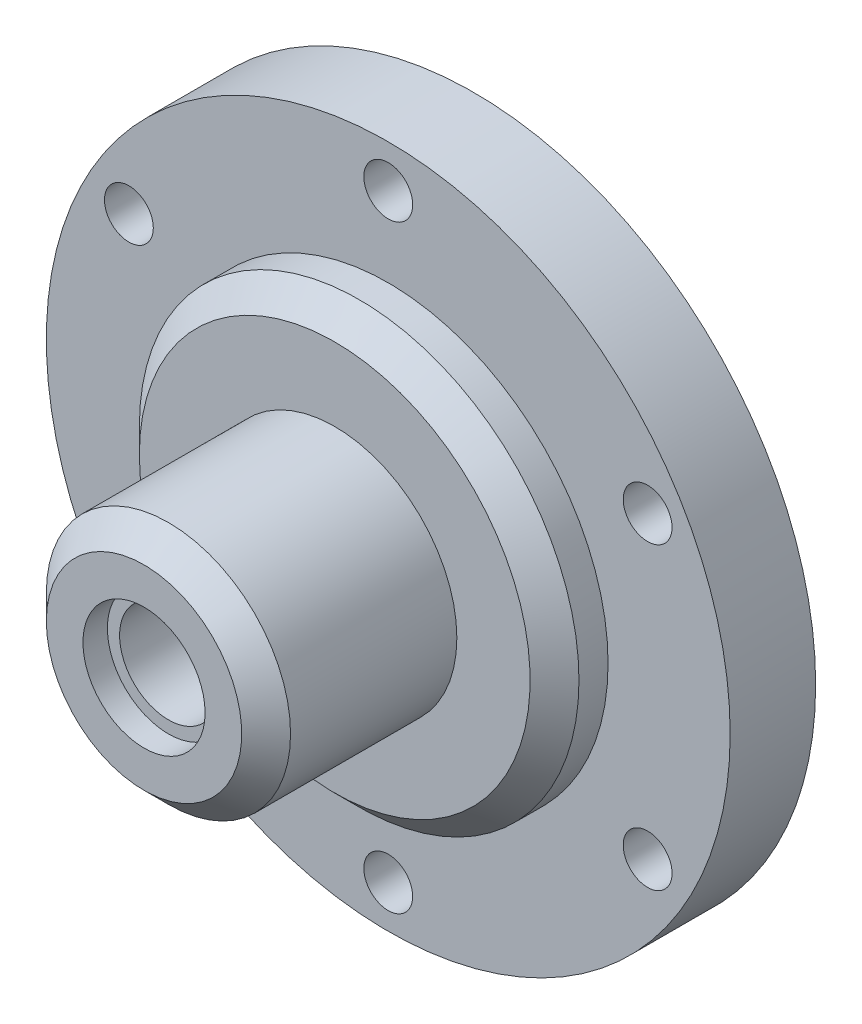
ISO-10303-21;
HEADER;
FILE_DESCRIPTION(('STEP AP214'),'2;1');
FILE_NAME('part.step','',(''),(''),'','','');
FILE_SCHEMA(('AUTOMOTIVE_DESIGN { 1 0 10303 214 1 1 1 1 }'));
ENDSEC;
DATA;
#1=APPLICATION_CONTEXT('core data for automotive mechanical design processes');
#2=APPLICATION_PROTOCOL_DEFINITION('international standard','automotive_design',2000,#1);
#3=PRODUCT_CONTEXT('',#1,'mechanical');
#4=PRODUCT('Part','Part','',(#3));
#5=PRODUCT_RELATED_PRODUCT_CATEGORY('part','',(#4));
#6=PRODUCT_DEFINITION_FORMATION('','',#4);
#7=PRODUCT_DEFINITION_CONTEXT('part definition',#1,'design');
#8=PRODUCT_DEFINITION('design','',#6,#7);
#9=PRODUCT_DEFINITION_SHAPE('','',#8);
#10=(LENGTH_UNIT() NAMED_UNIT(*) SI_UNIT(.MILLI.,.METRE.));
#11=(NAMED_UNIT(*) PLANE_ANGLE_UNIT() SI_UNIT($,.RADIAN.));
#12=(NAMED_UNIT(*) SI_UNIT($,.STERADIAN.) SOLID_ANGLE_UNIT());
#13=UNCERTAINTY_MEASURE_WITH_UNIT(LENGTH_MEASURE(1.E-05),#10,'distance_accuracy_value','');
#14=(GEOMETRIC_REPRESENTATION_CONTEXT(3) GLOBAL_UNCERTAINTY_ASSIGNED_CONTEXT((#13)) GLOBAL_UNIT_ASSIGNED_CONTEXT((#10,
#11,#12)) REPRESENTATION_CONTEXT('',''));
#15=CARTESIAN_POINT('',(0.,0.,0.));
#16=DIRECTION('',(0.,0.,1.));
#17=DIRECTION('',(1.,0.,0.));
#18=AXIS2_PLACEMENT_3D('',#15,#16,#17);
#19=CARTESIAN_POINT('',(0.,0.936746115772721,48528.1313955082));
#20=DIRECTION('',(0.,0.,1.));
#21=DIRECTION('',(1.,0.,0.));
#22=AXIS2_PLACEMENT_3D('',#19,#20,#21);
#23=CYLINDRICAL_SURFACE('',#22,200.);
#24=CARTESIAN_POINT('',(0.,0.936746115772721,-29.0164538128706));
#25=DIRECTION('',(0.,0.,1.));
#26=DIRECTION('',(1.,0.,0.));
#27=AXIS2_PLACEMENT_3D('',#24,#25,#26);
#28=CIRCLE('',#27,200.);
#29=CARTESIAN_POINT('',(200.,0.936746115772721,-29.0164538128706));
#30=VERTEX_POINT('',#29);
#31=EDGE_CURVE('E168',#30,#30,#28,.T.);
#32=ORIENTED_EDGE('',*,*,#31,.F.);
#33=EDGE_LOOP('',(#32));
#34=FACE_BOUND('',#33,.T.);
#35=CARTESIAN_POINT('',(0.,0.936746115772721,870.983546187129));
#36=DIRECTION('',(0.,0.,1.));
#37=DIRECTION('',(1.,0.,0.));
#38=AXIS2_PLACEMENT_3D('',#35,#36,#37);
#39=CIRCLE('',#38,199.999999999617);
#40=CARTESIAN_POINT('',(199.999999999617,0.936746115772721,870.983546187129));
#41=VERTEX_POINT('',#40);
#42=EDGE_CURVE('E374',#41,#41,#39,.T.);
#43=ORIENTED_EDGE('',*,*,#42,.T.);
#44=EDGE_LOOP('',(#43));
#45=FACE_BOUND('',#44,.T.);
#46=ADVANCED_FACE('F46',(#34,#45),#23,.F.);
#47=CARTESIAN_POINT('',(0.,0.936746115772721,-29.0164538128706));
#48=DIRECTION('',(0.,0.,1.));
#49=DIRECTION('',(1.,0.,0.));
#50=AXIS2_PLACEMENT_3D('',#47,#48,#49);
#51=PLANE('',#50);
#52=DIRECTION('',(0.,-1.,0.));
#53=VECTOR('',#52,1.);
#54=CARTESIAN_POINT('',(100.,750.936746115774,-29.0164538128706));
#55=LINE('',#54,#53);
#56=CARTESIAN_POINT('',(100.,750.936746115774,-29.0164538128706));
#57=VERTEX_POINT('',#56);
#58=CARTESIAN_POINT('',(100.,693.757069143324,-29.0164538128706));
#59=VERTEX_POINT('',#58);
#60=EDGE_CURVE('E92',#57,#59,#55,.T.);
#61=ORIENTED_EDGE('',*,*,#60,.T.);
#62=CARTESIAN_POINT('',(0.,0.936746115772721,-29.0164538128706));
#63=DIRECTION('',(0.,0.,1.));
#64=DIRECTION('',(1.,0.,0.));
#65=AXIS2_PLACEMENT_3D('',#62,#63,#64);
#66=CIRCLE('',#65,700.);
#67=CARTESIAN_POINT('',(-100.,693.757069143324,-29.0164538128706));
#68=VERTEX_POINT('',#67);
#69=EDGE_CURVE('E183',#68,#59,#66,.T.);
#70=ORIENTED_EDGE('',*,*,#69,.F.);
#71=DIRECTION('',(0.,1.,0.));
#72=VECTOR('',#71,1.);
#73=CARTESIAN_POINT('',(-99.9999999999999,750.936746115774,-29.0164538128706));
#74=LINE('',#73,#72);
#75=CARTESIAN_POINT('',(-99.9999999999999,750.936746115774,-29.0164538128706));
#76=VERTEX_POINT('',#75);
#77=EDGE_CURVE('E61',#68,#76,#74,.T.);
#78=ORIENTED_EDGE('',*,*,#77,.T.);
#79=DIRECTION('',(1.,0.,0.));
#80=VECTOR('',#79,1.);
#81=CARTESIAN_POINT('',(100.,750.936746115774,-29.0164538128706));
#82=LINE('',#81,#80);
#83=EDGE_CURVE('E101',#76,#57,#82,.T.);
#84=ORIENTED_EDGE('',*,*,#83,.T.);
#85=EDGE_LOOP('',(#61,#70,#78,#84));
#86=FACE_BOUND('',#85,.T.);
#87=ORIENTED_EDGE('',*,*,#31,.T.);
#88=EDGE_LOOP('',(#87));
#89=FACE_BOUND('',#88,.T.);
#90=ADVANCED_FACE('F189',(#86,#89),#51,.F.);
#91=CARTESIAN_POINT('',(0.,200.936746115773,970.983546187129));
#92=DIRECTION('',(0.,0.,-1.));
#93=DIRECTION('',(-1.,0.,0.));
#94=AXIS2_PLACEMENT_3D('',#91,#92,#93);
#95=PLANE('',#94);
#96=CARTESIAN_POINT('',(0.,0.936746115772721,970.983546187129));
#97=DIRECTION('',(0.,0.,1.));
#98=DIRECTION('',(1.,0.,0.));
#99=AXIS2_PLACEMENT_3D('',#96,#97,#98);
#100=CIRCLE('',#99,249.999999999617);
#101=CARTESIAN_POINT('',(249.999999999617,0.936746115772721,970.983546187129));
#102=VERTEX_POINT('',#101);
#103=EDGE_CURVE('E109',#102,#102,#100,.T.);
#104=ORIENTED_EDGE('',*,*,#103,.F.);
#105=EDGE_LOOP('',(#104));
#106=FACE_BOUND('',#105,.T.);
#107=CARTESIAN_POINT('',(0.,0.936746115772721,970.983546187129));
#108=DIRECTION('',(0.,0.,-1.));
#109=DIRECTION('',(-1.,0.,0.));
#110=AXIS2_PLACEMENT_3D('',#107,#108,#109);
#111=CIRCLE('',#110,399.999999999993);
#112=CARTESIAN_POINT('',(-399.999999999993,0.936746115772721,970.983546187129));
#113=VERTEX_POINT('',#112);
#114=EDGE_CURVE('E177',#113,#113,#111,.F.);
#115=ORIENTED_EDGE('',*,*,#114,.T.);
#116=EDGE_LOOP('',(#115));
#117=FACE_BOUND('',#116,.T.);
#118=ADVANCED_FACE('F211',(#106,#117),#95,.F.);
#119=CARTESIAN_POINT('',(0.,0.936746115772721,48528.1313955082));
#120=DIRECTION('',(0.,0.,1.));
#121=DIRECTION('',(1.,0.,0.));
#122=AXIS2_PLACEMENT_3D('',#119,#120,#121);
#123=CYLINDRICAL_SURFACE('',#122,500.);
#124=CARTESIAN_POINT('',(0.,0.936746115772721,870.983546187128));
#125=DIRECTION('',(0.,0.,-1.));
#126=DIRECTION('',(-1.,0.,0.));
#127=AXIS2_PLACEMENT_3D('',#124,#125,#126);
#128=CIRCLE('',#127,500.);
#129=CARTESIAN_POINT('',(-500.,0.936746115772721,870.983546187128));
#130=VERTEX_POINT('',#129);
#131=EDGE_CURVE('E180',#130,#130,#128,.T.);
#132=ORIENTED_EDGE('',*,*,#131,.T.);
#133=EDGE_LOOP('',(#132));
#134=FACE_BOUND('',#133,.T.);
#135=CARTESIAN_POINT('',(0.,0.936746115772721,190.103102033601));
#136=DIRECTION('',(0.,0.,1.));
#137=DIRECTION('',(1.,0.,0.));
#138=AXIS2_PLACEMENT_3D('',#135,#136,#137);
#139=CIRCLE('',#138,500.);
#140=CARTESIAN_POINT('',(500.,0.936746115772721,190.103102033601));
#141=VERTEX_POINT('',#140);
#142=EDGE_CURVE('E165',#141,#141,#139,.T.);
#143=ORIENTED_EDGE('',*,*,#142,.T.);
#144=EDGE_LOOP('',(#143));
#145=FACE_BOUND('',#144,.T.);
#146=ADVANCED_FACE('F236',(#134,#145),#123,.T.);
#147=CARTESIAN_POINT('',(0.,500.936746115772,190.1031020336));
#148=DIRECTION('',(0.,0.,-1.));
#149=DIRECTION('',(-1.,0.,0.));
#150=AXIS2_PLACEMENT_3D('',#147,#148,#149);
#151=PLANE('',#150);
#152=CARTESIAN_POINT('',(0.,0.936746115772721,190.1031020336));
#153=DIRECTION('',(0.,0.,-1.));
#154=DIRECTION('',(-1.,0.,0.));
#155=AXIS2_PLACEMENT_3D('',#152,#153,#154);
#156=CIRCLE('',#155,800.000000000005);
#157=CARTESIAN_POINT('',(-800.000000000005,0.936746115772721,190.1031020336));
#158=VERTEX_POINT('',#157);
#159=EDGE_CURVE('E171',#158,#158,#156,.F.);
#160=ORIENTED_EDGE('',*,*,#159,.T.);
#161=EDGE_LOOP('',(#160));
#162=FACE_BOUND('',#161,.T.);
#163=ORIENTED_EDGE('',*,*,#142,.F.);
#164=EDGE_LOOP('',(#163));
#165=FACE_BOUND('',#164,.T.);
#166=ADVANCED_FACE('F227',(#162,#165),#151,.F.);
#167=CARTESIAN_POINT('',(0.,0.936746115772721,48528.1313955082));
#168=DIRECTION('',(0.,0.,1.));
#169=DIRECTION('',(1.,0.,0.));
#170=AXIS2_PLACEMENT_3D('',#167,#168,#169);
#171=CYLINDRICAL_SURFACE('',#170,900.);
#172=CARTESIAN_POINT('',(0.,0.936746115772721,90.1031020336035));
#173=DIRECTION('',(0.,0.,-1.));
#174=DIRECTION('',(-1.,0.,0.));
#175=AXIS2_PLACEMENT_3D('',#172,#173,#174);
#176=CIRCLE('',#175,900.);
#177=CARTESIAN_POINT('',(-900.,0.936746115772721,90.1031020336035));
#178=VERTEX_POINT('',#177);
#179=EDGE_CURVE('E174',#178,#178,#176,.T.);
#180=ORIENTED_EDGE('',*,*,#179,.T.);
#181=EDGE_LOOP('',(#180));
#182=FACE_BOUND('',#181,.T.);
#183=CARTESIAN_POINT('',(0.,0.936746115772721,-29.0164538128706));
#184=DIRECTION('',(0.,0.,1.));
#185=DIRECTION('',(1.,0.,0.));
#186=AXIS2_PLACEMENT_3D('',#183,#184,#185);
#187=CIRCLE('',#186,900.);
#188=CARTESIAN_POINT('',(900.,0.936746115772721,-29.0164538128706));
#189=VERTEX_POINT('',#188);
#190=EDGE_CURVE('E160',#189,#189,#187,.T.);
#191=ORIENTED_EDGE('',*,*,#190,.T.);
#192=EDGE_LOOP('',(#191));
#193=FACE_BOUND('',#192,.T.);
#194=ADVANCED_FACE('F219',(#182,#193),#171,.T.);
#195=CARTESIAN_POINT('',(0.,0.936746115772721,190.103102033601));
#196=DIRECTION('',(0.,0.,-1.));
#197=DIRECTION('',(-1.,0.,0.));
#198=AXIS2_PLACEMENT_3D('',#195,#196,#197);
#199=CONICAL_SURFACE('',#198,800.000000000004,0.785398163397439);
#200=ORIENTED_EDGE('',*,*,#179,.F.);
#201=EDGE_LOOP('',(#200));
#202=FACE_BOUND('',#201,.T.);
#203=ORIENTED_EDGE('',*,*,#159,.F.);
#204=EDGE_LOOP('',(#203));
#205=FACE_BOUND('',#204,.T.);
#206=ADVANCED_FACE('F217',(#202,#205),#199,.T.);
#207=CARTESIAN_POINT('',(0.,0.936746115772721,970.983546187126));
#208=DIRECTION('',(0.,0.,-1.));
#209=DIRECTION('',(-1.,0.,0.));
#210=AXIS2_PLACEMENT_3D('',#207,#208,#209);
#211=CONICAL_SURFACE('',#210,399.999999999997,0.785398163397473);
#212=ORIENTED_EDGE('',*,*,#131,.F.);
#213=EDGE_LOOP('',(#212));
#214=FACE_BOUND('',#213,.T.);
#215=ORIENTED_EDGE('',*,*,#114,.F.);
#216=EDGE_LOOP('',(#215));
#217=FACE_BOUND('',#216,.T.);
#218=ADVANCED_FACE('F48',(#214,#217),#211,.T.);
#219=CARTESIAN_POINT('',(0.,0.936746115772721,-379.016453812871));
#220=DIRECTION('',(0.,0.,1.));
#221=DIRECTION('',(1.,0.,0.));
#222=AXIS2_PLACEMENT_3D('',#219,#220,#221);
#223=CYLINDRICAL_SURFACE('',#222,1400.);
#224=CARTESIAN_POINT('',(0.,0.936746115772721,-379.016453812871));
#225=DIRECTION('',(0.,0.,1.));
#226=DIRECTION('',(1.,0.,0.));
#227=AXIS2_PLACEMENT_3D('',#224,#225,#226);
#228=CIRCLE('',#227,1400.);
#229=CARTESIAN_POINT('',(1400.,0.936746115772721,-379.016453812871));
#230=VERTEX_POINT('',#229);
#231=EDGE_CURVE('E157',#230,#230,#228,.T.);
#232=ORIENTED_EDGE('',*,*,#231,.T.);
#233=EDGE_LOOP('',(#232));
#234=FACE_BOUND('',#233,.T.);
#235=CARTESIAN_POINT('',(0.,0.936746115772721,-29.0164538128706));
#236=DIRECTION('',(0.,0.,1.));
#237=DIRECTION('',(1.,0.,0.));
#238=AXIS2_PLACEMENT_3D('',#235,#236,#237);
#239=CIRCLE('',#238,1400.);
#240=CARTESIAN_POINT('',(1400.,0.936746115772721,-29.0164538128706));
#241=VERTEX_POINT('',#240);
#242=EDGE_CURVE('E156',#241,#241,#239,.T.);
#243=ORIENTED_EDGE('',*,*,#242,.F.);
#244=EDGE_LOOP('',(#243));
#245=FACE_BOUND('',#244,.T.);
#246=ADVANCED_FACE('F225',(#234,#245),#223,.T.);
#247=CARTESIAN_POINT('',(0.,0.936746115772721,-379.016453812871));
#248=DIRECTION('',(0.,0.,1.));
#249=DIRECTION('',(1.,0.,0.));
#250=AXIS2_PLACEMENT_3D('',#247,#248,#249);
#251=PLANE('',#250);
#252=CARTESIAN_POINT('',(0.,0.936746115772721,-379.016453812871));
#253=DIRECTION('',(0.,0.,1.));
#254=DIRECTION('',(1.,0.,0.));
#255=AXIS2_PLACEMENT_3D('',#252,#253,#254);
#256=CIRCLE('',#255,700.);
#257=CARTESIAN_POINT('',(-100.,693.757069143324,-379.016453812871));
#258=VERTEX_POINT('',#257);
#259=CARTESIAN_POINT('',(100.,693.757069143324,-379.016453812871));
#260=VERTEX_POINT('',#259);
#261=EDGE_CURVE('E122',#258,#260,#256,.T.);
#262=ORIENTED_EDGE('',*,*,#261,.T.);
#263=DIRECTION('',(0.,-1.,0.));
#264=VECTOR('',#263,1.);
#265=CARTESIAN_POINT('',(100.,750.936746115774,-379.016453812871));
#266=LINE('',#265,#264);
#267=CARTESIAN_POINT('',(100.,750.936746115774,-379.016453812871));
#268=VERTEX_POINT('',#267);
#269=EDGE_CURVE('E69',#268,#260,#266,.T.);
#270=ORIENTED_EDGE('',*,*,#269,.F.);
#271=DIRECTION('',(1.,0.,0.));
#272=VECTOR('',#271,1.);
#273=CARTESIAN_POINT('',(100.,750.936746115774,-379.016453812871));
#274=LINE('',#273,#272);
#275=CARTESIAN_POINT('',(-99.9999999999999,750.936746115774,-379.016453812871));
#276=VERTEX_POINT('',#275);
#277=EDGE_CURVE('E99',#276,#268,#274,.T.);
#278=ORIENTED_EDGE('',*,*,#277,.F.);
#279=DIRECTION('',(0.,1.,0.));
#280=VECTOR('',#279,1.);
#281=CARTESIAN_POINT('',(-99.9999999999999,750.936746115774,-379.016453812871));
#282=LINE('',#281,#280);
#283=EDGE_CURVE('E84',#258,#276,#282,.T.);
#284=ORIENTED_EDGE('',*,*,#283,.F.);
#285=EDGE_LOOP('',(#262,#270,#278,#284));
#286=FACE_BOUND('',#285,.T.);
#287=CARTESIAN_POINT('',(0.,1227.18674611577,-379.016453812871));
#288=DIRECTION('',(0.,0.,1.));
#289=DIRECTION('',(1.,0.,0.));
#290=AXIS2_PLACEMENT_3D('',#287,#288,#289);
#291=CIRCLE('',#290,100.);
#292=CARTESIAN_POINT('',(99.9999999999999,1227.18674611577,-379.016453812871));
#293=VERTEX_POINT('',#292);
#294=EDGE_CURVE('E119',#293,#293,#291,.T.);
#295=ORIENTED_EDGE('',*,*,#294,.T.);
#296=EDGE_LOOP('',(#295));
#297=FACE_BOUND('',#296,.T.);
#298=CARTESIAN_POINT('',(-1061.96365139066,614.061746115785,-379.016453812871));
#299=DIRECTION('',(0.,0.,1.));
#300=DIRECTION('',(1.,0.,0.));
#301=AXIS2_PLACEMENT_3D('',#298,#299,#300);
#302=CIRCLE('',#301,100.);
#303=CARTESIAN_POINT('',(-961.963651390661,614.061746115785,-379.016453812871));
#304=VERTEX_POINT('',#303);
#305=EDGE_CURVE('E118',#304,#304,#302,.T.);
#306=ORIENTED_EDGE('',*,*,#305,.T.);
#307=EDGE_LOOP('',(#306));
#308=FACE_BOUND('',#307,.T.);
#309=CARTESIAN_POINT('',(-1061.96365139067,-612.188253884217,-379.016453812871));
#310=DIRECTION('',(0.,0.,1.));
#311=DIRECTION('',(1.,0.,0.));
#312=AXIS2_PLACEMENT_3D('',#309,#310,#311);
#313=CIRCLE('',#312,100.);
#314=CARTESIAN_POINT('',(-961.963651390674,-612.188253884217,-379.016453812871));
#315=VERTEX_POINT('',#314);
#316=EDGE_CURVE('E130',#315,#315,#313,.T.);
#317=ORIENTED_EDGE('',*,*,#316,.T.);
#318=EDGE_LOOP('',(#317));
#319=FACE_BOUND('',#318,.T.);
#320=CARTESIAN_POINT('',(-8.63872100725658E-12,-1225.31325388423,-379.016453812871));
#321=DIRECTION('',(0.,0.,1.));
#322=DIRECTION('',(1.,0.,0.));
#323=AXIS2_PLACEMENT_3D('',#320,#321,#322);
#324=CIRCLE('',#323,100.);
#325=CARTESIAN_POINT('',(99.9999999999914,-1225.31325388423,-379.016453812871));
#326=VERTEX_POINT('',#325);
#327=EDGE_CURVE('E147',#326,#326,#324,.T.);
#328=ORIENTED_EDGE('',*,*,#327,.T.);
#329=EDGE_LOOP('',(#328));
#330=FACE_BOUND('',#329,.T.);
#331=CARTESIAN_POINT('',(1061.96365139067,-612.188253884232,-379.016453812871));
#332=DIRECTION('',(0.,0.,1.));
#333=DIRECTION('',(1.,0.,0.));
#334=AXIS2_PLACEMENT_3D('',#331,#332,#333);
#335=CIRCLE('',#334,100.);
#336=CARTESIAN_POINT('',(1161.96365139067,-612.188253884232,-379.016453812871));
#337=VERTEX_POINT('',#336);
#338=EDGE_CURVE('E141',#337,#337,#335,.T.);
#339=ORIENTED_EDGE('',*,*,#338,.T.);
#340=EDGE_LOOP('',(#339));
#341=FACE_BOUND('',#340,.T.);
#342=CARTESIAN_POINT('',(1061.96365139067,614.06174611577,-379.016453812871));
#343=DIRECTION('',(0.,0.,1.));
#344=DIRECTION('',(1.,0.,0.));
#345=AXIS2_PLACEMENT_3D('',#342,#343,#344);
#346=CIRCLE('',#345,99.9999999999999);
#347=CARTESIAN_POINT('',(1161.96365139067,614.06174611577,-379.016453812871));
#348=VERTEX_POINT('',#347);
#349=EDGE_CURVE('E135',#348,#348,#346,.T.);
#350=ORIENTED_EDGE('',*,*,#349,.T.);
#351=EDGE_LOOP('',(#350));
#352=FACE_BOUND('',#351,.T.);
#353=ORIENTED_EDGE('',*,*,#231,.F.);
#354=EDGE_LOOP('',(#353));
#355=FACE_BOUND('',#354,.T.);
#356=ADVANCED_FACE('F103',(#286,#297,#308,#319,#330,#341,#352,#355),#251,.F.);
#357=CARTESIAN_POINT('',(0.,0.936746115772721,-29.0164538128706));
#358=DIRECTION('',(0.,0.,1.));
#359=DIRECTION('',(1.,0.,0.));
#360=AXIS2_PLACEMENT_3D('',#357,#358,#359);
#361=PLANE('',#360);
#362=CARTESIAN_POINT('',(0.,1227.18674611577,-29.0164538128706));
#363=DIRECTION('',(0.,0.,1.));
#364=DIRECTION('',(1.,0.,0.));
#365=AXIS2_PLACEMENT_3D('',#362,#363,#364);
#366=CIRCLE('',#365,100.);
#367=CARTESIAN_POINT('',(99.9999999999999,1227.18674611577,-29.0164538128706));
#368=VERTEX_POINT('',#367);
#369=EDGE_CURVE('E123',#368,#368,#366,.T.);
#370=ORIENTED_EDGE('',*,*,#369,.F.);
#371=EDGE_LOOP('',(#370));
#372=FACE_BOUND('',#371,.T.);
#373=CARTESIAN_POINT('',(-1061.96365139066,614.061746115785,-29.0164538128706));
#374=DIRECTION('',(0.,0.,1.));
#375=DIRECTION('',(1.,0.,0.));
#376=AXIS2_PLACEMENT_3D('',#373,#374,#375);
#377=CIRCLE('',#376,100.);
#378=CARTESIAN_POINT('',(-961.963651390661,614.061746115785,-29.0164538128706));
#379=VERTEX_POINT('',#378);
#380=EDGE_CURVE('E127',#379,#379,#377,.T.);
#381=ORIENTED_EDGE('',*,*,#380,.F.);
#382=EDGE_LOOP('',(#381));
#383=FACE_BOUND('',#382,.T.);
#384=CARTESIAN_POINT('',(-1061.96365139067,-612.188253884217,-29.0164538128706));
#385=DIRECTION('',(0.,0.,1.));
#386=DIRECTION('',(1.,0.,0.));
#387=AXIS2_PLACEMENT_3D('',#384,#385,#386);
#388=CIRCLE('',#387,100.);
#389=CARTESIAN_POINT('',(-961.963651390674,-612.188253884217,-29.0164538128706));
#390=VERTEX_POINT('',#389);
#391=EDGE_CURVE('E150',#390,#390,#388,.T.);
#392=ORIENTED_EDGE('',*,*,#391,.F.);
#393=EDGE_LOOP('',(#392));
#394=FACE_BOUND('',#393,.T.);
#395=CARTESIAN_POINT('',(-8.63872100725658E-12,-1225.31325388423,-29.0164538128706));
#396=DIRECTION('',(0.,0.,1.));
#397=DIRECTION('',(1.,0.,0.));
#398=AXIS2_PLACEMENT_3D('',#395,#396,#397);
#399=CIRCLE('',#398,100.);
#400=CARTESIAN_POINT('',(99.9999999999914,-1225.31325388423,-29.0164538128706));
#401=VERTEX_POINT('',#400);
#402=EDGE_CURVE('E144',#401,#401,#399,.T.);
#403=ORIENTED_EDGE('',*,*,#402,.F.);
#404=EDGE_LOOP('',(#403));
#405=FACE_BOUND('',#404,.T.);
#406=CARTESIAN_POINT('',(1061.96365139067,-612.188253884232,-29.0164538128706));
#407=DIRECTION('',(0.,0.,1.));
#408=DIRECTION('',(1.,0.,0.));
#409=AXIS2_PLACEMENT_3D('',#406,#407,#408);
#410=CIRCLE('',#409,100.);
#411=CARTESIAN_POINT('',(1161.96365139067,-612.188253884232,-29.0164538128706));
#412=VERTEX_POINT('',#411);
#413=EDGE_CURVE('E138',#412,#412,#410,.T.);
#414=ORIENTED_EDGE('',*,*,#413,.F.);
#415=EDGE_LOOP('',(#414));
#416=FACE_BOUND('',#415,.T.);
#417=CARTESIAN_POINT('',(1061.96365139067,614.06174611577,-29.0164538128706));
#418=DIRECTION('',(0.,0.,1.));
#419=DIRECTION('',(1.,0.,0.));
#420=AXIS2_PLACEMENT_3D('',#417,#418,#419);
#421=CIRCLE('',#420,99.9999999999999);
#422=CARTESIAN_POINT('',(1161.96365139067,614.06174611577,-29.0164538128706));
#423=VERTEX_POINT('',#422);
#424=EDGE_CURVE('E126',#423,#423,#421,.T.);
#425=ORIENTED_EDGE('',*,*,#424,.F.);
#426=EDGE_LOOP('',(#425));
#427=FACE_BOUND('',#426,.T.);
#428=ORIENTED_EDGE('',*,*,#190,.F.);
#429=EDGE_LOOP('',(#428));
#430=FACE_BOUND('',#429,.T.);
#431=ORIENTED_EDGE('',*,*,#242,.T.);
#432=EDGE_LOOP('',(#431));
#433=FACE_BOUND('',#432,.T.);
#434=ADVANCED_FACE('F249',(#372,#383,#394,#405,#416,#427,#430,#433),#361,.T.);
#435=CARTESIAN_POINT('',(0.,0.936746115772721,-379.016453812871));
#436=DIRECTION('',(0.,0.,1.));
#437=DIRECTION('',(1.,0.,0.));
#438=AXIS2_PLACEMENT_3D('',#435,#436,#437);
#439=CYLINDRICAL_SURFACE('',#438,700.);
#440=ORIENTED_EDGE('',*,*,#69,.T.);
#441=DIRECTION('',(0.,0.,1.));
#442=VECTOR('',#441,1.);
#443=CARTESIAN_POINT('',(100.,693.757069143324,-379.016453812871));
#444=LINE('',#443,#442);
#445=EDGE_CURVE('E12',#59,#260,#444,.F.);
#446=ORIENTED_EDGE('',*,*,#445,.T.);
#447=ORIENTED_EDGE('',*,*,#261,.F.);
#448=DIRECTION('',(0.,0.,1.));
#449=VECTOR('',#448,1.);
#450=CARTESIAN_POINT('',(-100.,693.757069143324,-379.016453812871));
#451=LINE('',#450,#449);
#452=EDGE_CURVE('E54',#258,#68,#451,.T.);
#453=ORIENTED_EDGE('',*,*,#452,.T.);
#454=EDGE_LOOP('',(#440,#446,#447,#453));
#455=FACE_BOUND('',#454,.T.);
#456=ADVANCED_FACE('F187',(#455),#439,.F.);
#457=CARTESIAN_POINT('',(1061.96365139067,614.06174611577,-379.016453812871));
#458=DIRECTION('',(0.,0.,1.));
#459=DIRECTION('',(1.,0.,0.));
#460=AXIS2_PLACEMENT_3D('',#457,#458,#459);
#461=CYLINDRICAL_SURFACE('',#460,99.9999999999999);
#462=ORIENTED_EDGE('',*,*,#349,.F.);
#463=EDGE_LOOP('',(#462));
#464=FACE_BOUND('',#463,.T.);
#465=ORIENTED_EDGE('',*,*,#424,.T.);
#466=EDGE_LOOP('',(#465));
#467=FACE_BOUND('',#466,.T.);
#468=ADVANCED_FACE('F257',(#464,#467),#461,.F.);
#469=CARTESIAN_POINT('',(1061.96365139067,-612.188253884232,-379.016453812871));
#470=DIRECTION('',(0.,0.,1.));
#471=DIRECTION('',(1.,0.,0.));
#472=AXIS2_PLACEMENT_3D('',#469,#470,#471);
#473=CYLINDRICAL_SURFACE('',#472,100.);
#474=ORIENTED_EDGE('',*,*,#338,.F.);
#475=EDGE_LOOP('',(#474));
#476=FACE_BOUND('',#475,.T.);
#477=ORIENTED_EDGE('',*,*,#413,.T.);
#478=EDGE_LOOP('',(#477));
#479=FACE_BOUND('',#478,.T.);
#480=ADVANCED_FACE('F265',(#476,#479),#473,.F.);
#481=CARTESIAN_POINT('',(-8.63872100725658E-12,-1225.31325388423,-379.016453812871));
#482=DIRECTION('',(0.,0.,1.));
#483=DIRECTION('',(1.,0.,0.));
#484=AXIS2_PLACEMENT_3D('',#481,#482,#483);
#485=CYLINDRICAL_SURFACE('',#484,100.);
#486=ORIENTED_EDGE('',*,*,#327,.F.);
#487=EDGE_LOOP('',(#486));
#488=FACE_BOUND('',#487,.T.);
#489=ORIENTED_EDGE('',*,*,#402,.T.);
#490=EDGE_LOOP('',(#489));
#491=FACE_BOUND('',#490,.T.);
#492=ADVANCED_FACE('F261',(#488,#491),#485,.F.);
#493=CARTESIAN_POINT('',(-1061.96365139067,-612.188253884217,-379.016453812871));
#494=DIRECTION('',(0.,0.,1.));
#495=DIRECTION('',(1.,0.,0.));
#496=AXIS2_PLACEMENT_3D('',#493,#494,#495);
#497=CYLINDRICAL_SURFACE('',#496,100.);
#498=ORIENTED_EDGE('',*,*,#316,.F.);
#499=EDGE_LOOP('',(#498));
#500=FACE_BOUND('',#499,.T.);
#501=ORIENTED_EDGE('',*,*,#391,.T.);
#502=EDGE_LOOP('',(#501));
#503=FACE_BOUND('',#502,.T.);
#504=ADVANCED_FACE('F258',(#500,#503),#497,.F.);
#505=CARTESIAN_POINT('',(-1061.96365139066,614.061746115785,-379.016453812871));
#506=DIRECTION('',(0.,0.,1.));
#507=DIRECTION('',(1.,0.,0.));
#508=AXIS2_PLACEMENT_3D('',#505,#506,#507);
#509=CYLINDRICAL_SURFACE('',#508,100.);
#510=ORIENTED_EDGE('',*,*,#305,.F.);
#511=EDGE_LOOP('',(#510));
#512=FACE_BOUND('',#511,.T.);
#513=ORIENTED_EDGE('',*,*,#380,.T.);
#514=EDGE_LOOP('',(#513));
#515=FACE_BOUND('',#514,.T.);
#516=ADVANCED_FACE('F200',(#512,#515),#509,.F.);
#517=CARTESIAN_POINT('',(0.,1227.18674611577,-379.016453812871));
#518=DIRECTION('',(0.,0.,1.));
#519=DIRECTION('',(1.,0.,0.));
#520=AXIS2_PLACEMENT_3D('',#517,#518,#519);
#521=CYLINDRICAL_SURFACE('',#520,100.);
#522=ORIENTED_EDGE('',*,*,#294,.F.);
#523=EDGE_LOOP('',(#522));
#524=FACE_BOUND('',#523,.T.);
#525=ORIENTED_EDGE('',*,*,#369,.T.);
#526=EDGE_LOOP('',(#525));
#527=FACE_BOUND('',#526,.T.);
#528=ADVANCED_FACE('F193',(#524,#527),#521,.F.);
#529=CARTESIAN_POINT('',(100.,750.936746115774,182.998237369024));
#530=DIRECTION('',(1.,0.,0.));
#531=DIRECTION('',(0.,1.,0.));
#532=AXIS2_PLACEMENT_3D('',#529,#530,#531);
#533=PLANE('',#532);
#534=ORIENTED_EDGE('',*,*,#60,.F.);
#535=DIRECTION('',(0.,0.,-1.));
#536=VECTOR('',#535,1.);
#537=CARTESIAN_POINT('',(100.,750.936746115774,182.998237369024));
#538=LINE('',#537,#536);
#539=EDGE_CURVE('E115',#57,#268,#538,.T.);
#540=ORIENTED_EDGE('',*,*,#539,.T.);
#541=ORIENTED_EDGE('',*,*,#269,.T.);
#542=ORIENTED_EDGE('',*,*,#445,.F.);
#543=EDGE_LOOP('',(#534,#540,#541,#542));
#544=FACE_BOUND('',#543,.T.);
#545=ADVANCED_FACE('F191',(#544),#533,.F.);
#546=CARTESIAN_POINT('',(-99.9999999999999,750.936746115774,182.998237369024));
#547=DIRECTION('',(-1.,0.,0.));
#548=DIRECTION('',(0.,-1.,0.));
#549=AXIS2_PLACEMENT_3D('',#546,#547,#548);
#550=PLANE('',#549);
#551=ORIENTED_EDGE('',*,*,#283,.T.);
#552=DIRECTION('',(0.,0.,-1.));
#553=VECTOR('',#552,1.);
#554=CARTESIAN_POINT('',(-99.9999999999999,750.936746115774,182.998237369024));
#555=LINE('',#554,#553);
#556=EDGE_CURVE('E87',#76,#276,#555,.T.);
#557=ORIENTED_EDGE('',*,*,#556,.F.);
#558=ORIENTED_EDGE('',*,*,#77,.F.);
#559=ORIENTED_EDGE('',*,*,#452,.F.);
#560=EDGE_LOOP('',(#551,#557,#558,#559));
#561=FACE_BOUND('',#560,.T.);
#562=ADVANCED_FACE('F86',(#561),#550,.F.);
#563=CARTESIAN_POINT('',(100.,750.936746115774,182.998237369024));
#564=DIRECTION('',(0.,1.,0.));
#565=DIRECTION('',(0.,0.,1.));
#566=AXIS2_PLACEMENT_3D('',#563,#564,#565);
#567=PLANE('',#566);
#568=ORIENTED_EDGE('',*,*,#556,.T.);
#569=ORIENTED_EDGE('',*,*,#277,.T.);
#570=ORIENTED_EDGE('',*,*,#539,.F.);
#571=ORIENTED_EDGE('',*,*,#83,.F.);
#572=EDGE_LOOP('',(#568,#569,#570,#571));
#573=FACE_BOUND('',#572,.T.);
#574=ADVANCED_FACE('F97',(#573),#567,.F.);
#575=CARTESIAN_POINT('',(0.,0.936746115772721,870.983546187129));
#576=DIRECTION('',(0.,0.,1.));
#577=DIRECTION('',(1.,0.,0.));
#578=AXIS2_PLACEMENT_3D('',#575,#576,#577);
#579=CYLINDRICAL_SURFACE('',#578,249.999999999617);
#580=CARTESIAN_POINT('',(0.,0.936746115772721,870.983546187129));
#581=DIRECTION('',(0.,0.,1.));
#582=DIRECTION('',(1.,0.,0.));
#583=AXIS2_PLACEMENT_3D('',#580,#581,#582);
#584=CIRCLE('',#583,249.999999999617);
#585=CARTESIAN_POINT('',(249.999999999617,0.936746115772721,870.983546187129));
#586=VERTEX_POINT('',#585);
#587=EDGE_CURVE('E105',#586,#586,#584,.T.);
#588=ORIENTED_EDGE('',*,*,#587,.F.);
#589=EDGE_LOOP('',(#588));
#590=FACE_BOUND('',#589,.T.);
#591=ORIENTED_EDGE('',*,*,#103,.T.);
#592=EDGE_LOOP('',(#591));
#593=FACE_BOUND('',#592,.T.);
#594=ADVANCED_FACE('F345',(#590,#593),#579,.F.);
#595=CARTESIAN_POINT('',(0.,0.936746115772721,870.983546187129));
#596=DIRECTION('',(0.,0.,1.));
#597=DIRECTION('',(1.,0.,0.));
#598=AXIS2_PLACEMENT_3D('',#595,#596,#597);
#599=PLANE('',#598);
#600=ORIENTED_EDGE('',*,*,#42,.F.);
#601=EDGE_LOOP('',(#600));
#602=FACE_BOUND('',#601,.T.);
#603=ORIENTED_EDGE('',*,*,#587,.T.);
#604=EDGE_LOOP('',(#603));
#605=FACE_BOUND('',#604,.T.);
#606=ADVANCED_FACE('F358',(#602,#605),#599,.T.);
#607=CLOSED_SHELL('',(#46,#90,#118,#146,#166,#194,#206,#218,#246,#356,#434,#456,#468,#480,#492,
#504,#516,#528,#545,#562,#574,#594,#606));
#608=MANIFOLD_SOLID_BREP('B2',#607);
#609=ADVANCED_BREP_SHAPE_REPRESENTATION('',(#18,#608),#14);
#610=SHAPE_DEFINITION_REPRESENTATION(#9,#609);
ENDSEC;
END-ISO-10303-21;
